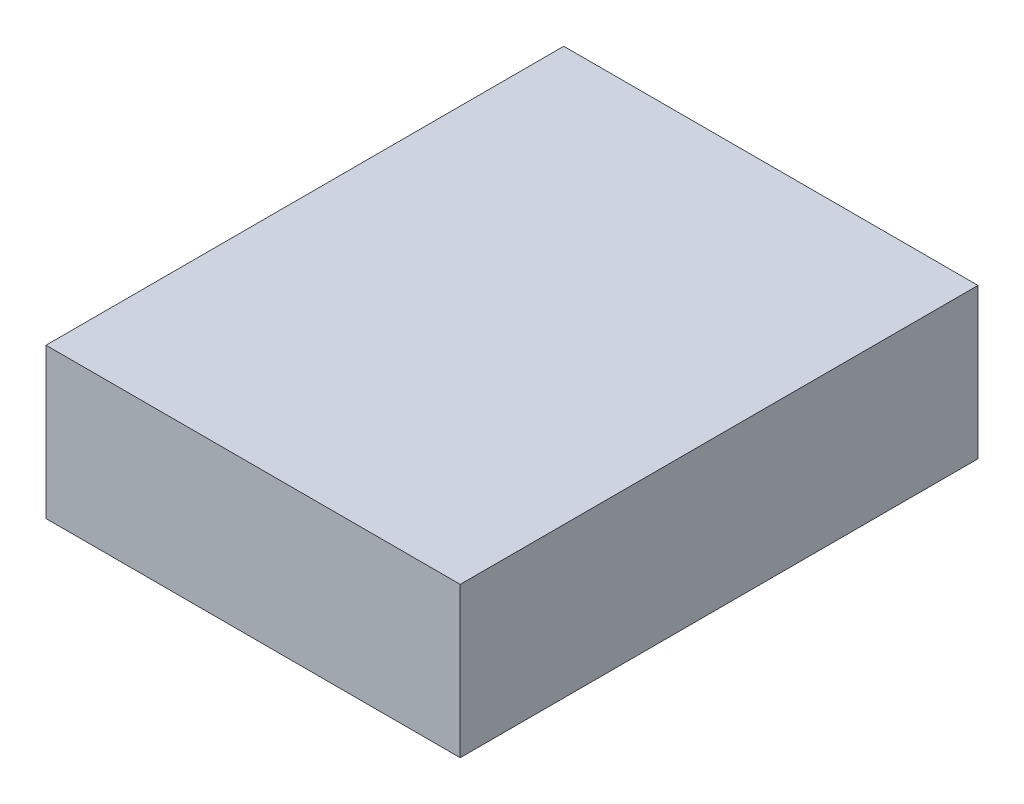
ISO-10303-21;
HEADER;
FILE_DESCRIPTION(('STEP AP214'),'2;1');
FILE_NAME('part.step','',(''),(''),'','','');
FILE_SCHEMA(('AUTOMOTIVE_DESIGN { 1 0 10303 214 1 1 1 1 }'));
ENDSEC;
DATA;
#1=APPLICATION_CONTEXT('core data for automotive mechanical design processes');
#2=APPLICATION_PROTOCOL_DEFINITION('international standard','automotive_design',2000,#1);
#3=PRODUCT_CONTEXT('',#1,'mechanical');
#4=PRODUCT('Part','Part','',(#3));
#5=PRODUCT_RELATED_PRODUCT_CATEGORY('part','',(#4));
#6=PRODUCT_DEFINITION_FORMATION('','',#4);
#7=PRODUCT_DEFINITION_CONTEXT('part definition',#1,'design');
#8=PRODUCT_DEFINITION('design','',#6,#7);
#9=PRODUCT_DEFINITION_SHAPE('','',#8);
#10=(LENGTH_UNIT() NAMED_UNIT(*) SI_UNIT(.MILLI.,.METRE.));
#11=(NAMED_UNIT(*) PLANE_ANGLE_UNIT() SI_UNIT($,.RADIAN.));
#12=(NAMED_UNIT(*) SI_UNIT($,.STERADIAN.) SOLID_ANGLE_UNIT());
#13=UNCERTAINTY_MEASURE_WITH_UNIT(LENGTH_MEASURE(1.E-05),#10,'distance_accuracy_value','');
#14=(GEOMETRIC_REPRESENTATION_CONTEXT(3) GLOBAL_UNCERTAINTY_ASSIGNED_CONTEXT((#13)) GLOBAL_UNIT_ASSIGNED_CONTEXT((#10,
#11,#12)) REPRESENTATION_CONTEXT('',''));
#15=CARTESIAN_POINT('',(0.,0.,0.));
#16=DIRECTION('',(0.,0.,1.));
#17=DIRECTION('',(1.,0.,0.));
#18=AXIS2_PLACEMENT_3D('',#15,#16,#17);
#19=CARTESIAN_POINT('',(40.,29.,-50.));
#20=DIRECTION('',(-1.,0.,0.));
#21=DIRECTION('',(0.,0.,1.));
#22=AXIS2_PLACEMENT_3D('',#19,#20,#21);
#23=PLANE('',#22);
#24=DIRECTION('',(0.,0.,-1.));
#25=VECTOR('',#24,1.);
#26=CARTESIAN_POINT('',(40.,0.,-50.));
#27=LINE('',#26,#25);
#28=CARTESIAN_POINT('',(40.,0.,50.));
#29=VERTEX_POINT('',#28);
#30=CARTESIAN_POINT('',(40.,0.,-50.));
#31=VERTEX_POINT('',#30);
#32=EDGE_CURVE('E100',#29,#31,#27,.T.);
#33=ORIENTED_EDGE('',*,*,#32,.T.);
#34=DIRECTION('',(0.,-1.,0.));
#35=VECTOR('',#34,1.);
#36=CARTESIAN_POINT('',(40.,29.,-50.));
#37=LINE('',#36,#35);
#38=CARTESIAN_POINT('',(40.,29.,-50.));
#39=VERTEX_POINT('',#38);
#40=EDGE_CURVE('E11',#39,#31,#37,.T.);
#41=ORIENTED_EDGE('',*,*,#40,.F.);
#42=DIRECTION('',(0.,0.,-1.));
#43=VECTOR('',#42,1.);
#44=CARTESIAN_POINT('',(40.,29.,-50.));
#45=LINE('',#44,#43);
#46=CARTESIAN_POINT('',(40.,29.,50.));
#47=VERTEX_POINT('',#46);
#48=EDGE_CURVE('E88',#47,#39,#45,.T.);
#49=ORIENTED_EDGE('',*,*,#48,.F.);
#50=DIRECTION('',(0.,-1.,0.));
#51=VECTOR('',#50,1.);
#52=CARTESIAN_POINT('',(40.,29.,50.));
#53=LINE('',#52,#51);
#54=EDGE_CURVE('E96',#47,#29,#53,.T.);
#55=ORIENTED_EDGE('',*,*,#54,.T.);
#56=EDGE_LOOP('',(#33,#41,#49,#55));
#57=FACE_BOUND('',#56,.T.);
#58=ADVANCED_FACE('F37',(#57),#23,.F.);
#59=CARTESIAN_POINT('',(-40.,29.,-50.));
#60=DIRECTION('',(0.,0.,1.));
#61=DIRECTION('',(1.,0.,0.));
#62=AXIS2_PLACEMENT_3D('',#59,#60,#61);
#63=PLANE('',#62);
#64=DIRECTION('',(-1.,0.,0.));
#65=VECTOR('',#64,1.);
#66=CARTESIAN_POINT('',(-40.,0.,-50.));
#67=LINE('',#66,#65);
#68=CARTESIAN_POINT('',(-40.,0.,-50.));
#69=VERTEX_POINT('',#68);
#70=EDGE_CURVE('E92',#31,#69,#67,.T.);
#71=ORIENTED_EDGE('',*,*,#70,.T.);
#72=DIRECTION('',(0.,-1.,0.));
#73=VECTOR('',#72,1.);
#74=CARTESIAN_POINT('',(-40.,29.,-50.));
#75=LINE('',#74,#73);
#76=CARTESIAN_POINT('',(-40.,29.,-50.));
#77=VERTEX_POINT('',#76);
#78=EDGE_CURVE('E45',#77,#69,#75,.T.);
#79=ORIENTED_EDGE('',*,*,#78,.F.);
#80=DIRECTION('',(-1.,0.,0.));
#81=VECTOR('',#80,1.);
#82=CARTESIAN_POINT('',(-40.,29.,-50.));
#83=LINE('',#82,#81);
#84=EDGE_CURVE('E83',#39,#77,#83,.T.);
#85=ORIENTED_EDGE('',*,*,#84,.F.);
#86=ORIENTED_EDGE('',*,*,#40,.T.);
#87=EDGE_LOOP('',(#71,#79,#85,#86));
#88=FACE_BOUND('',#87,.T.);
#89=ADVANCED_FACE('F91',(#88),#63,.F.);
#90=CARTESIAN_POINT('',(-40.,29.,-50.));
#91=DIRECTION('',(1.,0.,0.));
#92=DIRECTION('',(0.,0.,-1.));
#93=AXIS2_PLACEMENT_3D('',#90,#91,#92);
#94=PLANE('',#93);
#95=DIRECTION('',(0.,0.,1.));
#96=VECTOR('',#95,1.);
#97=CARTESIAN_POINT('',(-40.,0.,-50.));
#98=LINE('',#97,#96);
#99=CARTESIAN_POINT('',(-40.,0.,50.));
#100=VERTEX_POINT('',#99);
#101=EDGE_CURVE('E70',#69,#100,#98,.T.);
#102=ORIENTED_EDGE('',*,*,#101,.T.);
#103=DIRECTION('',(0.,-1.,0.));
#104=VECTOR('',#103,1.);
#105=CARTESIAN_POINT('',(-40.,29.,50.));
#106=LINE('',#105,#104);
#107=CARTESIAN_POINT('',(-40.,29.,50.));
#108=VERTEX_POINT('',#107);
#109=EDGE_CURVE('E93',#108,#100,#106,.T.);
#110=ORIENTED_EDGE('',*,*,#109,.F.);
#111=DIRECTION('',(0.,0.,1.));
#112=VECTOR('',#111,1.);
#113=CARTESIAN_POINT('',(-40.,29.,-50.));
#114=LINE('',#113,#112);
#115=EDGE_CURVE('E86',#77,#108,#114,.T.);
#116=ORIENTED_EDGE('',*,*,#115,.F.);
#117=ORIENTED_EDGE('',*,*,#78,.T.);
#118=EDGE_LOOP('',(#102,#110,#116,#117));
#119=FACE_BOUND('',#118,.T.);
#120=ADVANCED_FACE('F94',(#119),#94,.F.);
#121=CARTESIAN_POINT('',(-40.,29.,50.));
#122=DIRECTION('',(0.,0.,-1.));
#123=DIRECTION('',(-1.,0.,0.));
#124=AXIS2_PLACEMENT_3D('',#121,#122,#123);
#125=PLANE('',#124);
#126=DIRECTION('',(1.,0.,0.));
#127=VECTOR('',#126,1.);
#128=CARTESIAN_POINT('',(-40.,0.,50.));
#129=LINE('',#128,#127);
#130=EDGE_CURVE('E76',#100,#29,#129,.T.);
#131=ORIENTED_EDGE('',*,*,#130,.T.);
#132=ORIENTED_EDGE('',*,*,#54,.F.);
#133=DIRECTION('',(1.,0.,0.));
#134=VECTOR('',#133,1.);
#135=CARTESIAN_POINT('',(-40.,29.,50.));
#136=LINE('',#135,#134);
#137=EDGE_CURVE('E53',#108,#47,#136,.T.);
#138=ORIENTED_EDGE('',*,*,#137,.F.);
#139=ORIENTED_EDGE('',*,*,#109,.T.);
#140=EDGE_LOOP('',(#131,#132,#138,#139));
#141=FACE_BOUND('',#140,.T.);
#142=ADVANCED_FACE('F107',(#141),#125,.F.);
#143=CARTESIAN_POINT('',(0.,29.,0.));
#144=DIRECTION('',(0.,1.,0.));
#145=DIRECTION('',(0.,0.,1.));
#146=AXIS2_PLACEMENT_3D('',#143,#144,#145);
#147=PLANE('',#146);
#148=ORIENTED_EDGE('',*,*,#48,.T.);
#149=ORIENTED_EDGE('',*,*,#84,.T.);
#150=ORIENTED_EDGE('',*,*,#115,.T.);
#151=ORIENTED_EDGE('',*,*,#137,.T.);
#152=EDGE_LOOP('',(#148,#149,#150,#151));
#153=FACE_BOUND('',#152,.T.);
#154=ADVANCED_FACE('F84',(#153),#147,.T.);
#155=CARTESIAN_POINT('',(0.,0.,0.));
#156=DIRECTION('',(0.,1.,0.));
#157=DIRECTION('',(0.,0.,1.));
#158=AXIS2_PLACEMENT_3D('',#155,#156,#157);
#159=PLANE('',#158);
#160=ORIENTED_EDGE('',*,*,#32,.F.);
#161=ORIENTED_EDGE('',*,*,#130,.F.);
#162=ORIENTED_EDGE('',*,*,#101,.F.);
#163=ORIENTED_EDGE('',*,*,#70,.F.);
#164=EDGE_LOOP('',(#160,#161,#162,#163));
#165=FACE_BOUND('',#164,.T.);
#166=ADVANCED_FACE('F110',(#165),#159,.F.);
#167=CLOSED_SHELL('',(#58,#89,#120,#142,#154,#166));
#168=MANIFOLD_SOLID_BREP('B2',#167);
#169=ADVANCED_BREP_SHAPE_REPRESENTATION('',(#18,#168),#14);
#170=SHAPE_DEFINITION_REPRESENTATION(#9,#169);
ENDSEC;
END-ISO-10303-21;
